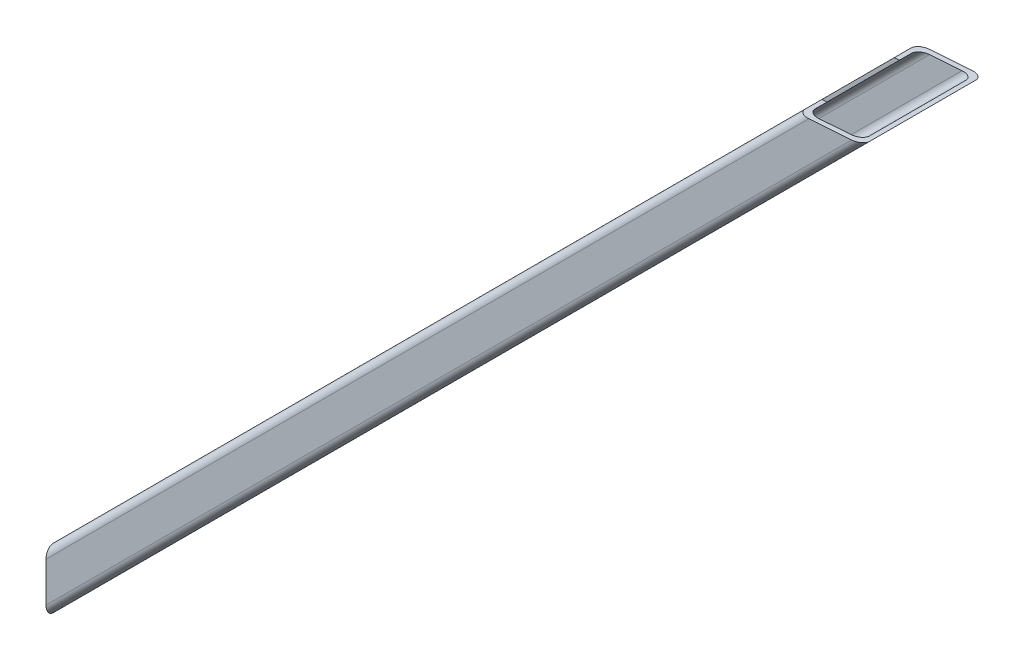
ISO-10303-21;
HEADER;
FILE_DESCRIPTION(('STEP AP214'),'2;1');
FILE_NAME('part.step','',(''),(''),'','','');
FILE_SCHEMA(('AUTOMOTIVE_DESIGN { 1 0 10303 214 1 1 1 1 }'));
ENDSEC;
DATA;
#1=APPLICATION_CONTEXT('core data for automotive mechanical design processes');
#2=APPLICATION_PROTOCOL_DEFINITION('international standard','automotive_design',2000,#1);
#3=PRODUCT_CONTEXT('',#1,'mechanical');
#4=PRODUCT('Part','Part','',(#3));
#5=PRODUCT_RELATED_PRODUCT_CATEGORY('part','',(#4));
#6=PRODUCT_DEFINITION_FORMATION('','',#4);
#7=PRODUCT_DEFINITION_CONTEXT('part definition',#1,'design');
#8=PRODUCT_DEFINITION('design','',#6,#7);
#9=PRODUCT_DEFINITION_SHAPE('','',#8);
#10=(LENGTH_UNIT() NAMED_UNIT(*) SI_UNIT(.MILLI.,.METRE.));
#11=(NAMED_UNIT(*) PLANE_ANGLE_UNIT() SI_UNIT($,.RADIAN.));
#12=(NAMED_UNIT(*) SI_UNIT($,.STERADIAN.) SOLID_ANGLE_UNIT());
#13=UNCERTAINTY_MEASURE_WITH_UNIT(LENGTH_MEASURE(1.E-05),#10,'distance_accuracy_value','');
#14=(GEOMETRIC_REPRESENTATION_CONTEXT(3) GLOBAL_UNCERTAINTY_ASSIGNED_CONTEXT((#13)) GLOBAL_UNIT_ASSIGNED_CONTEXT((#10,
#11,#12)) REPRESENTATION_CONTEXT('',''));
#15=CARTESIAN_POINT('',(0.,0.,0.));
#16=DIRECTION('',(0.,0.,1.));
#17=DIRECTION('',(1.,0.,0.));
#18=AXIS2_PLACEMENT_3D('',#15,#16,#17);
#19=CARTESIAN_POINT('',(750.740415748247,775.740415748239,-50.));
#20=DIRECTION('',(0.,0.,1.));
#21=DIRECTION('',(0.,-1.,0.));
#22=AXIS2_PLACEMENT_3D('',#19,#20,#21);
#23=PLANE('',#22);
#24=DIRECTION('',(0.,1.,0.));
#25=VECTOR('',#24,1.);
#26=CARTESIAN_POINT('',(0.,25.,-50.));
#27=LINE('',#26,#25);
#28=CARTESIAN_POINT('',(0.,-16.5147186257616,-50.));
#29=VERTEX_POINT('',#28);
#30=CARTESIAN_POINT('',(0.,16.5147186257615,-50.));
#31=VERTEX_POINT('',#30);
#32=EDGE_CURVE('E202',#29,#31,#27,.T.);
#33=ORIENTED_EDGE('',*,*,#32,.T.);
#34=DIRECTION('',(-0.707106781186551,-0.707106781186544,0.));
#35=VECTOR('',#34,1.);
#36=CARTESIAN_POINT('',(754.983056435366,771.49777506112,-50.));
#37=LINE('',#36,#35);
#38=CARTESIAN_POINT('',(633.182283742111,649.697002367866,-50.));
#39=VERTEX_POINT('',#38);
#40=EDGE_CURVE('E261',#31,#39,#37,.F.);
#41=ORIENTED_EDGE('',*,*,#40,.T.);
#42=DIRECTION('',(-0.997546761100416,-0.0700032814807309,0.));
#43=VECTOR('',#42,1.);
#44=CARTESIAN_POINT('',(758.966133401731,658.523939186085,-50.));
#45=LINE('',#44,#43);
#46=CARTESIAN_POINT('',(668.704508710731,652.189790084963,-50.));
#47=VERTEX_POINT('',#46);
#48=EDGE_CURVE('E184',#47,#39,#45,.T.);
#49=ORIENTED_EDGE('',*,*,#48,.F.);
#50=DIRECTION('',(-0.707106781186551,-0.707106781186544,0.));
#51=VECTOR('',#50,1.);
#52=CARTESIAN_POINT('',(771.497775061128,754.983056435358,-50.));
#53=LINE('',#52,#51);
#54=EDGE_CURVE('E258',#47,#29,#53,.T.);
#55=ORIENTED_EDGE('',*,*,#54,.T.);
#56=EDGE_LOOP('',(#33,#41,#49,#55));
#57=FACE_BOUND('',#56,.T.);
#58=ADVANCED_FACE('F34',(#57),#23,.F.);
#59=CARTESIAN_POINT('',(750.740415748247,775.740415748239,-30.));
#60=DIRECTION('',(0.707106781186544,-0.707106781186551,0.));
#61=DIRECTION('',(0.707106781186551,0.707106781186544,0.));
#62=AXIS2_PLACEMENT_3D('',#59,#60,#61);
#63=PLANE('',#62);
#64=DIRECTION('',(0.,0.,1.));
#65=VECTOR('',#64,1.);
#66=CARTESIAN_POINT('',(624.056603773591,649.056603773584,-30.0000000000001));
#67=LINE('',#66,#65);
#68=CARTESIAN_POINT('',(624.056603773591,649.056603773584,-44.));
#69=VERTEX_POINT('',#68);
#70=CARTESIAN_POINT('',(624.056603773591,649.056603773584,-30.));
#71=VERTEX_POINT('',#70);
#72=EDGE_CURVE('E171',#69,#71,#67,.T.);
#73=ORIENTED_EDGE('',*,*,#72,.F.);
#74=DIRECTION('',(-0.707106781186551,-0.707106781186544,0.));
#75=VECTOR('',#74,1.);
#76=CARTESIAN_POINT('',(750.740415748247,775.740415748239,-44.));
#77=LINE('',#76,#75);
#78=CARTESIAN_POINT('',(0.,25.,-44.));
#79=VERTEX_POINT('',#78);
#80=EDGE_CURVE('E256',#69,#79,#77,.T.);
#81=ORIENTED_EDGE('',*,*,#80,.T.);
#82=DIRECTION('',(0.,0.,1.));
#83=VECTOR('',#82,1.);
#84=CARTESIAN_POINT('',(0.,25.,-30.));
#85=LINE('',#84,#83);
#86=CARTESIAN_POINT('',(0.,25.,-30.));
#87=VERTEX_POINT('',#86);
#88=EDGE_CURVE('E198',#79,#87,#85,.T.);
#89=ORIENTED_EDGE('',*,*,#88,.T.);
#90=DIRECTION('',(-0.707106781186551,-0.707106781186544,0.));
#91=VECTOR('',#90,1.);
#92=CARTESIAN_POINT('',(750.740415748247,775.740415748239,-30.));
#93=LINE('',#92,#91);
#94=EDGE_CURVE('E191',#71,#87,#93,.T.);
#95=ORIENTED_EDGE('',*,*,#94,.F.);
#96=EDGE_LOOP('',(#73,#81,#89,#95));
#97=FACE_BOUND('',#96,.T.);
#98=ADVANCED_FACE('F196',(#97),#63,.F.);
#99=CARTESIAN_POINT('',(750.740415748247,775.740415748239,-30.));
#100=DIRECTION('',(0.,0.,-1.));
#101=DIRECTION('',(-1.,0.,0.));
#102=AXIS2_PLACEMENT_3D('',#99,#100,#101);
#103=PLANE('',#102);
#104=DIRECTION('',(0.997546761100416,0.0700032814807309,0.));
#105=VECTOR('',#104,1.);
#106=CARTESIAN_POINT('',(758.966133401731,658.523939186085,-30.));
#107=LINE('',#106,#105);
#108=CARTESIAN_POINT('',(628.358490566044,649.358490566037,-30.));
#109=VERTEX_POINT('',#108);
#110=EDGE_CURVE('E176',#71,#109,#107,.T.);
#111=ORIENTED_EDGE('',*,*,#110,.F.);
#112=ORIENTED_EDGE('',*,*,#94,.T.);
#113=DIRECTION('',(0.,-1.,0.));
#114=VECTOR('',#113,1.);
#115=CARTESIAN_POINT('',(0.,25.,-30.));
#116=LINE('',#115,#114);
#117=CARTESIAN_POINT('',(0.,21.,-30.));
#118=VERTEX_POINT('',#117);
#119=EDGE_CURVE('E199',#87,#118,#116,.T.);
#120=ORIENTED_EDGE('',*,*,#119,.T.);
#121=DIRECTION('',(-0.707106781186551,-0.707106781186544,0.));
#122=VECTOR('',#121,1.);
#123=CARTESIAN_POINT('',(750.740415748247,771.740415748239,-30.));
#124=LINE('',#123,#122);
#125=EDGE_CURVE('E193',#109,#118,#124,.T.);
#126=ORIENTED_EDGE('',*,*,#125,.F.);
#127=EDGE_LOOP('',(#111,#112,#120,#126));
#128=FACE_BOUND('',#127,.T.);
#129=ADVANCED_FACE('F189',(#128),#103,.F.);
#130=CARTESIAN_POINT('',(750.740415748247,771.740415748239,-30.));
#131=DIRECTION('',(-0.707106781186544,0.707106781186551,0.));
#132=DIRECTION('',(-0.707106781186551,-0.707106781186544,0.));
#133=AXIS2_PLACEMENT_3D('',#130,#131,#132);
#134=PLANE('',#133);
#135=DIRECTION('',(0.,0.,-1.));
#136=VECTOR('',#135,1.);
#137=CARTESIAN_POINT('',(0.,21.,-30.));
#138=LINE('',#137,#136);
#139=CARTESIAN_POINT('',(0.,21.,-40.));
#140=VERTEX_POINT('',#139);
#141=EDGE_CURVE('E209',#118,#140,#138,.T.);
#142=ORIENTED_EDGE('',*,*,#141,.T.);
#143=DIRECTION('',(-0.707106781186551,-0.707106781186544,0.));
#144=VECTOR('',#143,1.);
#145=CARTESIAN_POINT('',(628.358490566043,649.358490566037,-40.));
#146=LINE('',#145,#144);
#147=CARTESIAN_POINT('',(628.358490566044,649.358490566037,-40.));
#148=VERTEX_POINT('',#147);
#149=EDGE_CURVE('E224',#140,#148,#146,.F.);
#150=ORIENTED_EDGE('',*,*,#149,.T.);
#151=DIRECTION('',(0.,0.,-1.));
#152=VECTOR('',#151,1.);
#153=CARTESIAN_POINT('',(628.358490566044,649.358490566037,-30.0000000000001));
#154=LINE('',#153,#152);
#155=EDGE_CURVE('E194',#109,#148,#154,.T.);
#156=ORIENTED_EDGE('',*,*,#155,.F.);
#157=ORIENTED_EDGE('',*,*,#125,.T.);
#158=EDGE_LOOP('',(#142,#150,#156,#157));
#159=FACE_BOUND('',#158,.T.);
#160=ADVANCED_FACE('F384',(#159),#134,.F.);
#161=CARTESIAN_POINT('',(750.740415748247,771.740415748239,-46.));
#162=DIRECTION('',(0.,0.,-1.));
#163=DIRECTION('',(0.,1.,0.));
#164=AXIS2_PLACEMENT_3D('',#161,#162,#163);
#165=PLANE('',#164);
#166=DIRECTION('',(0.997546761100416,0.0700032814807309,0.));
#167=VECTOR('',#166,1.);
#168=CARTESIAN_POINT('',(758.686807214901,658.504337348413,-46.));
#169=LINE('',#168,#167);
#170=CARTESIAN_POINT('',(637.484170534564,649.998889160319,-46.));
#171=VERTEX_POINT('',#170);
#172=CARTESIAN_POINT('',(664.402621918278,651.88790329251,-46.));
#173=VERTEX_POINT('',#172);
#174=EDGE_CURVE('E310',#171,#173,#169,.T.);
#175=ORIENTED_EDGE('',*,*,#174,.F.);
#176=DIRECTION('',(-0.707106781186551,-0.707106781186544,0.));
#177=VECTOR('',#176,1.);
#178=CARTESIAN_POINT('',(4.24264068711877,16.7573593128802,-46.));
#179=LINE('',#178,#177);
#180=CARTESIAN_POINT('',(0.,12.5147186257615,-46.));
#181=VERTEX_POINT('',#180);
#182=EDGE_CURVE('E220',#171,#181,#179,.T.);
#183=ORIENTED_EDGE('',*,*,#182,.T.);
#184=DIRECTION('',(0.,-1.,0.));
#185=VECTOR('',#184,1.);
#186=CARTESIAN_POINT('',(0.,21.,-46.));
#187=LINE('',#186,#185);
#188=CARTESIAN_POINT('',(0.,-12.5147186257614,-46.));
#189=VERTEX_POINT('',#188);
#190=EDGE_CURVE('E294',#181,#189,#187,.T.);
#191=ORIENTED_EDGE('',*,*,#190,.T.);
#192=DIRECTION('',(-0.707106781186551,-0.707106781186544,0.));
#193=VECTOR('',#192,1.);
#194=CARTESIAN_POINT('',(669.285661199679,656.770942573911,-46.));
#195=LINE('',#194,#193);
#196=EDGE_CURVE('E218',#189,#173,#195,.F.);
#197=ORIENTED_EDGE('',*,*,#196,.T.);
#198=EDGE_LOOP('',(#175,#183,#191,#197));
#199=FACE_BOUND('',#198,.T.);
#200=ADVANCED_FACE('F391',(#199),#165,.F.);
#201=CARTESIAN_POINT('',(750.740415748247,729.740415748239,46.));
#202=DIRECTION('',(0.707106781186544,-0.707106781186551,0.));
#203=DIRECTION('',(0.707106781186551,0.707106781186544,0.));
#204=AXIS2_PLACEMENT_3D('',#201,#202,#203);
#205=PLANE('',#204);
#206=DIRECTION('',(0.,0.,1.));
#207=VECTOR('',#206,1.);
#208=CARTESIAN_POINT('',(673.528301886799,652.528301886792,46.));
#209=LINE('',#208,#207);
#210=CARTESIAN_POINT('',(673.528301886799,652.528301886792,-40.));
#211=VERTEX_POINT('',#210);
#212=CARTESIAN_POINT('',(673.528301886799,652.528301886792,40.));
#213=VERTEX_POINT('',#212);
#214=EDGE_CURVE('E302',#211,#213,#209,.T.);
#215=ORIENTED_EDGE('',*,*,#214,.F.);
#216=DIRECTION('',(-0.707106781186551,-0.707106781186544,0.));
#217=VECTOR('',#216,1.);
#218=CARTESIAN_POINT('',(-3.95403818382974E-13,-21.0000000000004,-40.));
#219=LINE('',#218,#217);
#220=CARTESIAN_POINT('',(0.,-21.,-40.));
#221=VERTEX_POINT('',#220);
#222=EDGE_CURVE('E269',#211,#221,#219,.T.);
#223=ORIENTED_EDGE('',*,*,#222,.T.);
#224=DIRECTION('',(0.,0.,1.));
#225=VECTOR('',#224,1.);
#226=CARTESIAN_POINT('',(0.,-21.,46.));
#227=LINE('',#226,#225);
#228=CARTESIAN_POINT('',(0.,-21.,40.));
#229=VERTEX_POINT('',#228);
#230=EDGE_CURVE('E287',#221,#229,#227,.T.);
#231=ORIENTED_EDGE('',*,*,#230,.T.);
#232=DIRECTION('',(-0.707106781186551,-0.707106781186544,0.));
#233=VECTOR('',#232,1.);
#234=CARTESIAN_POINT('',(673.528301886799,652.528301886792,40.));
#235=LINE('',#234,#233);
#236=EDGE_CURVE('E49',#229,#213,#235,.F.);
#237=ORIENTED_EDGE('',*,*,#236,.T.);
#238=EDGE_LOOP('',(#215,#223,#231,#237));
#239=FACE_BOUND('',#238,.T.);
#240=ADVANCED_FACE('F292',(#239),#205,.F.);
#241=CARTESIAN_POINT('',(750.740415748247,771.740415748239,46.));
#242=DIRECTION('',(0.,0.,1.));
#243=DIRECTION('',(0.,-1.,0.));
#244=AXIS2_PLACEMENT_3D('',#241,#242,#243);
#245=PLANE('',#244);
#246=DIRECTION('',(0.,1.,0.));
#247=VECTOR('',#246,1.);
#248=CARTESIAN_POINT('',(0.,21.,46.));
#249=LINE('',#248,#247);
#250=CARTESIAN_POINT('',(0.,-12.5147186257615,46.));
#251=VERTEX_POINT('',#250);
#252=CARTESIAN_POINT('',(0.,12.5147186257615,46.));
#253=VERTEX_POINT('',#252);
#254=EDGE_CURVE('E289',#251,#253,#249,.T.);
#255=ORIENTED_EDGE('',*,*,#254,.T.);
#256=DIRECTION('',(-0.707106781186551,-0.707106781186544,0.));
#257=VECTOR('',#256,1.);
#258=CARTESIAN_POINT('',(632.601131253163,645.115849878918,46.));
#259=LINE('',#258,#257);
#260=CARTESIAN_POINT('',(637.484170534564,649.998889160319,46.));
#261=VERTEX_POINT('',#260);
#262=EDGE_CURVE('E232',#253,#261,#259,.F.);
#263=ORIENTED_EDGE('',*,*,#262,.T.);
#264=DIRECTION('',(-0.997546761100416,-0.0700032814807309,0.));
#265=VECTOR('',#264,1.);
#266=CARTESIAN_POINT('',(758.686807214901,658.504337348413,46.));
#267=LINE('',#266,#265);
#268=CARTESIAN_POINT('',(664.402621918278,651.88790329251,46.));
#269=VERTEX_POINT('',#268);
#270=EDGE_CURVE('E300',#269,#261,#267,.T.);
#271=ORIENTED_EDGE('',*,*,#270,.F.);
#272=DIRECTION('',(-0.707106781186551,-0.707106781186544,0.));
#273=VECTOR('',#272,1.);
#274=CARTESIAN_POINT('',(-4.24264068711944,-16.7573593128809,46.));
#275=LINE('',#274,#273);
#276=EDGE_CURVE('E229',#269,#251,#275,.T.);
#277=ORIENTED_EDGE('',*,*,#276,.T.);
#278=EDGE_LOOP('',(#255,#263,#271,#277));
#279=FACE_BOUND('',#278,.T.);
#280=ADVANCED_FACE('F304',(#279),#245,.F.);
#281=CARTESIAN_POINT('',(750.740415748247,771.740415748239,46.));
#282=DIRECTION('',(-0.707106781186544,0.707106781186551,0.));
#283=DIRECTION('',(-0.707106781186551,-0.707106781186544,0.));
#284=AXIS2_PLACEMENT_3D('',#281,#282,#283);
#285=PLANE('',#284);
#286=DIRECTION('',(0.,0.,-1.));
#287=VECTOR('',#286,1.);
#288=CARTESIAN_POINT('',(628.358490566043,649.358490566037,45.9999999999999));
#289=LINE('',#288,#287);
#290=CARTESIAN_POINT('',(628.358490566043,649.358490566037,40.));
#291=VERTEX_POINT('',#290);
#292=CARTESIAN_POINT('',(628.358490566043,649.358490566037,30.));
#293=VERTEX_POINT('',#292);
#294=EDGE_CURVE('E306',#291,#293,#289,.T.);
#295=ORIENTED_EDGE('',*,*,#294,.F.);
#296=DIRECTION('',(-0.707106781186551,-0.707106781186544,0.));
#297=VECTOR('',#296,1.);
#298=CARTESIAN_POINT('',(0.,21.,40.));
#299=LINE('',#298,#297);
#300=CARTESIAN_POINT('',(0.,21.,40.));
#301=VERTEX_POINT('',#300);
#302=EDGE_CURVE('E226',#291,#301,#299,.T.);
#303=ORIENTED_EDGE('',*,*,#302,.T.);
#304=DIRECTION('',(0.,0.,-1.));
#305=VECTOR('',#304,1.);
#306=CARTESIAN_POINT('',(0.,21.,46.));
#307=LINE('',#306,#305);
#308=CARTESIAN_POINT('',(0.,21.,30.));
#309=VERTEX_POINT('',#308);
#310=EDGE_CURVE('E214',#301,#309,#307,.T.);
#311=ORIENTED_EDGE('',*,*,#310,.T.);
#312=DIRECTION('',(-0.707106781186551,-0.707106781186544,0.));
#313=VECTOR('',#312,1.);
#314=CARTESIAN_POINT('',(750.740415748247,771.740415748239,30.));
#315=LINE('',#314,#313);
#316=EDGE_CURVE('E210',#293,#309,#315,.T.);
#317=ORIENTED_EDGE('',*,*,#316,.F.);
#318=EDGE_LOOP('',(#295,#303,#311,#317));
#319=FACE_BOUND('',#318,.T.);
#320=ADVANCED_FACE('F354',(#319),#285,.F.);
#321=CARTESIAN_POINT('',(750.740415748247,775.740415748239,30.));
#322=DIRECTION('',(0.,0.,1.));
#323=DIRECTION('',(1.,0.,0.));
#324=AXIS2_PLACEMENT_3D('',#321,#322,#323);
#325=PLANE('',#324);
#326=DIRECTION('',(-0.997546761100416,-0.0700032814807309,0.));
#327=VECTOR('',#326,1.);
#328=CARTESIAN_POINT('',(758.966133401731,658.523939186085,30.));
#329=LINE('',#328,#327);
#330=CARTESIAN_POINT('',(624.05660377359,649.056603773584,30.));
#331=VERTEX_POINT('',#330);
#332=EDGE_CURVE('E308',#293,#331,#329,.T.);
#333=ORIENTED_EDGE('',*,*,#332,.F.);
#334=ORIENTED_EDGE('',*,*,#316,.T.);
#335=DIRECTION('',(0.,1.,0.));
#336=VECTOR('',#335,1.);
#337=CARTESIAN_POINT('',(0.,25.,30.));
#338=LINE('',#337,#336);
#339=CARTESIAN_POINT('',(0.,25.,30.));
#340=VERTEX_POINT('',#339);
#341=EDGE_CURVE('E213',#309,#340,#338,.T.);
#342=ORIENTED_EDGE('',*,*,#341,.T.);
#343=DIRECTION('',(-0.707106781186551,-0.707106781186544,0.));
#344=VECTOR('',#343,1.);
#345=CARTESIAN_POINT('',(750.740415748247,775.740415748239,30.));
#346=LINE('',#345,#344);
#347=EDGE_CURVE('E215',#331,#340,#346,.T.);
#348=ORIENTED_EDGE('',*,*,#347,.F.);
#349=EDGE_LOOP('',(#333,#334,#342,#348));
#350=FACE_BOUND('',#349,.T.);
#351=ADVANCED_FACE('F351',(#350),#325,.F.);
#352=CARTESIAN_POINT('',(750.740415748247,775.740415748239,50.));
#353=DIRECTION('',(0.707106781186544,-0.707106781186551,0.));
#354=DIRECTION('',(0.707106781186551,0.707106781186544,0.));
#355=AXIS2_PLACEMENT_3D('',#352,#353,#354);
#356=PLANE('',#355);
#357=DIRECTION('',(0.,0.,1.));
#358=VECTOR('',#357,1.);
#359=CARTESIAN_POINT('',(0.,25.,50.));
#360=LINE('',#359,#358);
#361=CARTESIAN_POINT('',(0.,25.,44.));
#362=VERTEX_POINT('',#361);
#363=EDGE_CURVE('E217',#340,#362,#360,.T.);
#364=ORIENTED_EDGE('',*,*,#363,.T.);
#365=DIRECTION('',(-0.707106781186551,-0.707106781186544,0.));
#366=VECTOR('',#365,1.);
#367=CARTESIAN_POINT('',(750.740415748247,775.740415748239,44.));
#368=LINE('',#367,#366);
#369=CARTESIAN_POINT('',(624.05660377359,649.056603773584,44.));
#370=VERTEX_POINT('',#369);
#371=EDGE_CURVE('E247',#362,#370,#368,.F.);
#372=ORIENTED_EDGE('',*,*,#371,.T.);
#373=DIRECTION('',(0.,0.,1.));
#374=VECTOR('',#373,1.);
#375=CARTESIAN_POINT('',(624.05660377359,649.056603773584,49.9999999999999));
#376=LINE('',#375,#374);
#377=EDGE_CURVE('E343',#331,#370,#376,.T.);
#378=ORIENTED_EDGE('',*,*,#377,.F.);
#379=ORIENTED_EDGE('',*,*,#347,.T.);
#380=EDGE_LOOP('',(#364,#372,#378,#379));
#381=FACE_BOUND('',#380,.T.);
#382=ADVANCED_FACE('F360',(#381),#356,.F.);
#383=CARTESIAN_POINT('',(750.740415748247,775.740415748239,50.));
#384=DIRECTION('',(0.,0.,-1.));
#385=DIRECTION('',(0.,1.,0.));
#386=AXIS2_PLACEMENT_3D('',#383,#384,#385);
#387=PLANE('',#386);
#388=DIRECTION('',(0.997546761100416,0.0700032814807309,0.));
#389=VECTOR('',#388,1.);
#390=CARTESIAN_POINT('',(758.966133401731,658.523939186085,50.));
#391=LINE('',#390,#389);
#392=CARTESIAN_POINT('',(633.182283742111,649.697002367866,50.));
#393=VERTEX_POINT('',#392);
#394=CARTESIAN_POINT('',(668.704508710731,652.189790084962,50.));
#395=VERTEX_POINT('',#394);
#396=EDGE_CURVE('E221',#393,#395,#391,.T.);
#397=ORIENTED_EDGE('',*,*,#396,.F.);
#398=DIRECTION('',(-0.707106781186551,-0.707106781186544,0.));
#399=VECTOR('',#398,1.);
#400=CARTESIAN_POINT('',(754.983056435366,771.49777506112,50.));
#401=LINE('',#400,#399);
#402=CARTESIAN_POINT('',(0.,16.5147186257615,50.));
#403=VERTEX_POINT('',#402);
#404=EDGE_CURVE('E236',#393,#403,#401,.T.);
#405=ORIENTED_EDGE('',*,*,#404,.T.);
#406=DIRECTION('',(0.,-1.,0.));
#407=VECTOR('',#406,1.);
#408=CARTESIAN_POINT('',(0.,25.,50.));
#409=LINE('',#408,#407);
#410=CARTESIAN_POINT('',(0.,-16.5147186257615,50.));
#411=VERTEX_POINT('',#410);
#412=EDGE_CURVE('E321',#403,#411,#409,.T.);
#413=ORIENTED_EDGE('',*,*,#412,.T.);
#414=DIRECTION('',(-0.707106781186551,-0.707106781186544,0.));
#415=VECTOR('',#414,1.);
#416=CARTESIAN_POINT('',(771.497775061128,754.983056435358,50.));
#417=LINE('',#416,#415);
#418=EDGE_CURVE('E234',#411,#395,#417,.F.);
#419=ORIENTED_EDGE('',*,*,#418,.T.);
#420=EDGE_LOOP('',(#397,#405,#413,#419));
#421=FACE_BOUND('',#420,.T.);
#422=ADVANCED_FACE('F367',(#421),#387,.F.);
#423=CARTESIAN_POINT('',(750.740415748247,725.740415748239,50.));
#424=DIRECTION('',(-0.707106781186544,0.707106781186551,0.));
#425=DIRECTION('',(-0.707106781186551,-0.707106781186544,0.));
#426=AXIS2_PLACEMENT_3D('',#423,#424,#425);
#427=PLANE('',#426);
#428=DIRECTION('',(0.,0.,-1.));
#429=VECTOR('',#428,1.);
#430=CARTESIAN_POINT('',(0.,-25.,50.));
#431=LINE('',#430,#429);
#432=CARTESIAN_POINT('',(0.,-25.,44.));
#433=VERTEX_POINT('',#432);
#434=CARTESIAN_POINT('',(0.,-25.,-44.));
#435=VERTEX_POINT('',#434);
#436=EDGE_CURVE('E317',#433,#435,#431,.T.);
#437=ORIENTED_EDGE('',*,*,#436,.T.);
#438=DIRECTION('',(-0.707106781186551,-0.707106781186544,0.));
#439=VECTOR('',#438,1.);
#440=CARTESIAN_POINT('',(750.740415748247,725.740415748239,-44.));
#441=LINE('',#440,#439);
#442=CARTESIAN_POINT('',(677.830188679252,652.830188679245,-44.));
#443=VERTEX_POINT('',#442);
#444=EDGE_CURVE('E266',#435,#443,#441,.F.);
#445=ORIENTED_EDGE('',*,*,#444,.T.);
#446=DIRECTION('',(0.,0.,-1.));
#447=VECTOR('',#446,1.);
#448=CARTESIAN_POINT('',(677.830188679252,652.830188679245,50.));
#449=LINE('',#448,#447);
#450=CARTESIAN_POINT('',(677.830188679252,652.830188679245,44.));
#451=VERTEX_POINT('',#450);
#452=EDGE_CURVE('E206',#451,#443,#449,.T.);
#453=ORIENTED_EDGE('',*,*,#452,.F.);
#454=DIRECTION('',(-0.707106781186551,-0.707106781186544,0.));
#455=VECTOR('',#454,1.);
#456=CARTESIAN_POINT('',(750.740415748247,725.740415748239,44.));
#457=LINE('',#456,#455);
#458=EDGE_CURVE('E263',#451,#433,#457,.T.);
#459=ORIENTED_EDGE('',*,*,#458,.T.);
#460=EDGE_LOOP('',(#437,#445,#453,#459));
#461=FACE_BOUND('',#460,.T.);
#462=ADVANCED_FACE('F371',(#461),#427,.F.);
#463=CARTESIAN_POINT('',(0.,0.,0.));
#464=DIRECTION('',(1.,0.,0.));
#465=DIRECTION('',(0.,0.,-1.));
#466=AXIS2_PLACEMENT_3D('',#463,#464,#465);
#467=PLANE('',#466);
#468=ORIENTED_EDGE('',*,*,#412,.F.);
#469=CARTESIAN_POINT('',(-1.11022302462516E-13,16.5147186257615,44.));
#470=DIRECTION('',(1.,0.,0.));
#471=DIRECTION('',(0.,-1.,0.));
#472=AXIS2_PLACEMENT_3D('',#469,#470,#471);
#473=ELLIPSE('',#472,8.48528137423853,6.);
#474=EDGE_CURVE('E245',#403,#362,#473,.F.);
#475=ORIENTED_EDGE('',*,*,#474,.T.);
#476=ORIENTED_EDGE('',*,*,#363,.F.);
#477=ORIENTED_EDGE('',*,*,#341,.F.);
#478=ORIENTED_EDGE('',*,*,#310,.F.);
#479=CARTESIAN_POINT('',(1.11022302462516E-13,12.5147186257616,40.));
#480=DIRECTION('',(1.,0.,0.));
#481=DIRECTION('',(0.,1.,0.));
#482=AXIS2_PLACEMENT_3D('',#479,#480,#481);
#483=ELLIPSE('',#482,8.48528137423853,6.);
#484=EDGE_CURVE('E276',#301,#253,#483,.T.);
#485=ORIENTED_EDGE('',*,*,#484,.T.);
#486=ORIENTED_EDGE('',*,*,#254,.F.);
#487=CARTESIAN_POINT('',(0.,-12.5147186257615,40.));
#488=DIRECTION('',(1.,0.,0.));
#489=DIRECTION('',(0.,1.,0.));
#490=AXIS2_PLACEMENT_3D('',#487,#488,#489);
#491=ELLIPSE('',#490,8.48528137423853,6.);
#492=EDGE_CURVE('E42',#251,#229,#491,.T.);
#493=ORIENTED_EDGE('',*,*,#492,.T.);
#494=ORIENTED_EDGE('',*,*,#230,.F.);
#495=CARTESIAN_POINT('',(0.,-12.5147186257616,-40.));
#496=DIRECTION('',(1.,0.,0.));
#497=DIRECTION('',(0.,1.,0.));
#498=AXIS2_PLACEMENT_3D('',#495,#496,#497);
#499=ELLIPSE('',#498,8.48528137423853,6.);
#500=EDGE_CURVE('E280',#221,#189,#499,.T.);
#501=ORIENTED_EDGE('',*,*,#500,.T.);
#502=ORIENTED_EDGE('',*,*,#190,.F.);
#503=CARTESIAN_POINT('',(-1.11022302462516E-13,12.5147186257615,-40.));
#504=DIRECTION('',(1.,0.,0.));
#505=DIRECTION('',(0.,1.,0.));
#506=AXIS2_PLACEMENT_3D('',#503,#504,#505);
#507=ELLIPSE('',#506,8.48528137423853,6.);
#508=EDGE_CURVE('E272',#181,#140,#507,.T.);
#509=ORIENTED_EDGE('',*,*,#508,.T.);
#510=ORIENTED_EDGE('',*,*,#141,.F.);
#511=ORIENTED_EDGE('',*,*,#119,.F.);
#512=ORIENTED_EDGE('',*,*,#88,.F.);
#513=CARTESIAN_POINT('',(-1.11022302462516E-13,16.5147186257615,-44.));
#514=DIRECTION('',(1.,0.,0.));
#515=DIRECTION('',(0.,-1.,0.));
#516=AXIS2_PLACEMENT_3D('',#513,#514,#515);
#517=ELLIPSE('',#516,8.48528137423853,6.);
#518=EDGE_CURVE('E243',#79,#31,#517,.F.);
#519=ORIENTED_EDGE('',*,*,#518,.T.);
#520=ORIENTED_EDGE('',*,*,#32,.F.);
#521=CARTESIAN_POINT('',(1.11022302462516E-13,-16.5147186257615,-44.));
#522=DIRECTION('',(1.,0.,0.));
#523=DIRECTION('',(0.,-1.,0.));
#524=AXIS2_PLACEMENT_3D('',#521,#522,#523);
#525=ELLIPSE('',#524,8.48528137423853,6.);
#526=EDGE_CURVE('E241',#29,#435,#525,.F.);
#527=ORIENTED_EDGE('',*,*,#526,.T.);
#528=ORIENTED_EDGE('',*,*,#436,.F.);
#529=CARTESIAN_POINT('',(0.,-16.5147186257616,44.));
#530=DIRECTION('',(1.,0.,0.));
#531=DIRECTION('',(0.,-1.,0.));
#532=AXIS2_PLACEMENT_3D('',#529,#530,#531);
#533=ELLIPSE('',#532,8.48528137423853,6.);
#534=EDGE_CURVE('E239',#433,#411,#533,.F.);
#535=ORIENTED_EDGE('',*,*,#534,.T.);
#536=EDGE_LOOP('',(#468,#475,#476,#477,#478,#485,#486,#493,#494,#501,#502,#509,#510,#511,#512,
#519,#520,#527,#528,#535));
#537=FACE_BOUND('',#536,.T.);
#538=ADVANCED_FACE('F286',(#537),#467,.F.);
#539=CARTESIAN_POINT('',(-217.640283301247,589.990155557806,49.9999999999985));
#540=DIRECTION('',(-0.0700032814807309,0.997546761100416,0.));
#541=DIRECTION('',(0.,0.,-1.));
#542=AXIS2_PLACEMENT_3D('',#539,#540,#541);
#543=PLANE('',#542);
#544=ORIENTED_EDGE('',*,*,#377,.T.);
#545=CARTESIAN_POINT('',(633.182283742111,649.697002367866,44.));
#546=DIRECTION('',(-0.0700032814807309,0.997546761100416,0.));
#547=DIRECTION('',(-0.997546761100416,-0.0700032814807309,0.));
#548=AXIS2_PLACEMENT_3D('',#545,#546,#547);
#549=ELLIPSE('',#548,9.14812249849224,6.);
#550=EDGE_CURVE('E254',#370,#393,#549,.T.);
#551=ORIENTED_EDGE('',*,*,#550,.T.);
#552=ORIENTED_EDGE('',*,*,#396,.T.);
#553=CARTESIAN_POINT('',(668.704508710731,652.189790084962,44.));
#554=DIRECTION('',(-0.0700032814807309,0.997546761100416,0.));
#555=DIRECTION('',(-0.997546761100416,-0.0700032814807309,0.));
#556=AXIS2_PLACEMENT_3D('',#553,#554,#555);
#557=ELLIPSE('',#556,9.14812249849224,6.);
#558=EDGE_CURVE('E249',#395,#451,#557,.T.);
#559=ORIENTED_EDGE('',*,*,#558,.T.);
#560=ORIENTED_EDGE('',*,*,#452,.T.);
#561=CARTESIAN_POINT('',(668.704508710731,652.189790084963,-44.));
#562=DIRECTION('',(-0.0700032814807309,0.997546761100416,0.));
#563=DIRECTION('',(-0.997546761100416,-0.0700032814807309,0.));
#564=AXIS2_PLACEMENT_3D('',#561,#562,#563);
#565=ELLIPSE('',#564,9.14812249849224,6.);
#566=EDGE_CURVE('E251',#443,#47,#565,.T.);
#567=ORIENTED_EDGE('',*,*,#566,.T.);
#568=ORIENTED_EDGE('',*,*,#48,.T.);
#569=CARTESIAN_POINT('',(633.182283742111,649.697002367866,-44.));
#570=DIRECTION('',(-0.0700032814807309,0.997546761100416,0.));
#571=DIRECTION('',(-0.997546761100416,-0.0700032814807309,0.));
#572=AXIS2_PLACEMENT_3D('',#569,#570,#571);
#573=ELLIPSE('',#572,9.14812249849224,6.);
#574=EDGE_CURVE('E179',#39,#69,#573,.T.);
#575=ORIENTED_EDGE('',*,*,#574,.T.);
#576=ORIENTED_EDGE('',*,*,#72,.T.);
#577=ORIENTED_EDGE('',*,*,#110,.T.);
#578=ORIENTED_EDGE('',*,*,#155,.T.);
#579=CARTESIAN_POINT('',(637.484170534564,649.998889160319,-40.));
#580=DIRECTION('',(-0.0700032814807309,0.997546761100416,0.));
#581=DIRECTION('',(0.997546761100416,0.0700032814807309,0.));
#582=AXIS2_PLACEMENT_3D('',#579,#580,#581);
#583=ELLIPSE('',#582,9.14812249849224,6.);
#584=EDGE_CURVE('E274',#148,#171,#583,.F.);
#585=ORIENTED_EDGE('',*,*,#584,.T.);
#586=ORIENTED_EDGE('',*,*,#174,.T.);
#587=CARTESIAN_POINT('',(664.402621918278,651.88790329251,-40.));
#588=DIRECTION('',(-0.0700032814807309,0.997546761100416,0.));
#589=DIRECTION('',(0.997546761100416,0.0700032814807309,0.));
#590=AXIS2_PLACEMENT_3D('',#587,#588,#589);
#591=ELLIPSE('',#590,9.14812249849224,6.);
#592=EDGE_CURVE('E56',#173,#211,#591,.F.);
#593=ORIENTED_EDGE('',*,*,#592,.T.);
#594=ORIENTED_EDGE('',*,*,#214,.T.);
#595=CARTESIAN_POINT('',(664.402621918278,651.88790329251,40.));
#596=DIRECTION('',(-0.0700032814807309,0.997546761100416,0.));
#597=DIRECTION('',(0.997546761100416,0.0700032814807309,0.));
#598=AXIS2_PLACEMENT_3D('',#595,#596,#597);
#599=ELLIPSE('',#598,9.14812249849224,6.);
#600=EDGE_CURVE('E11',#213,#269,#599,.F.);
#601=ORIENTED_EDGE('',*,*,#600,.T.);
#602=ORIENTED_EDGE('',*,*,#270,.T.);
#603=CARTESIAN_POINT('',(637.484170534564,649.998889160319,40.));
#604=DIRECTION('',(-0.0700032814807309,0.997546761100416,0.));
#605=DIRECTION('',(0.997546761100416,0.0700032814807309,0.));
#606=AXIS2_PLACEMENT_3D('',#603,#604,#605);
#607=ELLIPSE('',#606,9.14812249849224,6.);
#608=EDGE_CURVE('E278',#261,#291,#607,.F.);
#609=ORIENTED_EDGE('',*,*,#608,.T.);
#610=ORIENTED_EDGE('',*,*,#294,.T.);
#611=ORIENTED_EDGE('',*,*,#332,.T.);
#612=EDGE_LOOP('',(#544,#551,#552,#559,#560,#567,#568,#575,#576,#577,#578,#585,#586,#593,#594,
#601,#602,#609,#610,#611));
#613=FACE_BOUND('',#612,.T.);
#614=ADVANCED_FACE('F174',(#613),#543,.T.);
#615=CARTESIAN_POINT('',(754.983056435366,767.49777506112,-40.));
#616=DIRECTION('',(0.707106781186551,0.707106781186544,0.));
#617=DIRECTION('',(-0.707106781186544,0.707106781186551,0.));
#618=AXIS2_PLACEMENT_3D('',#615,#616,#617);
#619=CYLINDRICAL_SURFACE('',#618,6.);
#620=ORIENTED_EDGE('',*,*,#584,.F.);
#621=ORIENTED_EDGE('',*,*,#149,.F.);
#622=ORIENTED_EDGE('',*,*,#508,.F.);
#623=ORIENTED_EDGE('',*,*,#182,.F.);
#624=EDGE_LOOP('',(#620,#621,#622,#623));
#625=FACE_BOUND('',#624,.T.);
#626=ADVANCED_FACE('F387',(#625),#619,.F.);
#627=CARTESIAN_POINT('',(754.983056435366,767.49777506112,40.));
#628=DIRECTION('',(0.707106781186551,0.707106781186544,0.));
#629=DIRECTION('',(-0.707106781186544,0.707106781186551,0.));
#630=AXIS2_PLACEMENT_3D('',#627,#628,#629);
#631=CYLINDRICAL_SURFACE('',#630,6.);
#632=ORIENTED_EDGE('',*,*,#608,.F.);
#633=ORIENTED_EDGE('',*,*,#262,.F.);
#634=ORIENTED_EDGE('',*,*,#484,.F.);
#635=ORIENTED_EDGE('',*,*,#302,.F.);
#636=EDGE_LOOP('',(#632,#633,#634,#635));
#637=FACE_BOUND('',#636,.T.);
#638=ADVANCED_FACE('F414',(#637),#631,.F.);
#639=CARTESIAN_POINT('',(754.983056435366,771.49777506112,44.));
#640=DIRECTION('',(-0.707106781186551,-0.707106781186544,0.));
#641=DIRECTION('',(0.707106781186544,-0.707106781186551,0.));
#642=AXIS2_PLACEMENT_3D('',#639,#640,#641);
#643=CYLINDRICAL_SURFACE('',#642,6.);
#644=ORIENTED_EDGE('',*,*,#550,.F.);
#645=ORIENTED_EDGE('',*,*,#371,.F.);
#646=ORIENTED_EDGE('',*,*,#474,.F.);
#647=ORIENTED_EDGE('',*,*,#404,.F.);
#648=EDGE_LOOP('',(#644,#645,#646,#647));
#649=FACE_BOUND('',#648,.T.);
#650=ADVANCED_FACE('F362',(#649),#643,.T.);
#651=CARTESIAN_POINT('',(754.983056435366,771.49777506112,-44.));
#652=DIRECTION('',(-0.707106781186551,-0.707106781186544,0.));
#653=DIRECTION('',(0.707106781186544,-0.707106781186551,0.));
#654=AXIS2_PLACEMENT_3D('',#651,#652,#653);
#655=CYLINDRICAL_SURFACE('',#654,6.);
#656=ORIENTED_EDGE('',*,*,#574,.F.);
#657=ORIENTED_EDGE('',*,*,#40,.F.);
#658=ORIENTED_EDGE('',*,*,#518,.F.);
#659=ORIENTED_EDGE('',*,*,#80,.F.);
#660=EDGE_LOOP('',(#656,#657,#658,#659));
#661=FACE_BOUND('',#660,.T.);
#662=ADVANCED_FACE('F379',(#661),#655,.T.);
#663=CARTESIAN_POINT('',(771.497775061128,754.983056435358,-44.));
#664=DIRECTION('',(-0.707106781186551,-0.707106781186544,0.));
#665=DIRECTION('',(0.707106781186544,-0.707106781186551,0.));
#666=AXIS2_PLACEMENT_3D('',#663,#664,#665);
#667=CYLINDRICAL_SURFACE('',#666,6.);
#668=ORIENTED_EDGE('',*,*,#566,.F.);
#669=ORIENTED_EDGE('',*,*,#444,.F.);
#670=ORIENTED_EDGE('',*,*,#526,.F.);
#671=ORIENTED_EDGE('',*,*,#54,.F.);
#672=EDGE_LOOP('',(#668,#669,#670,#671));
#673=FACE_BOUND('',#672,.T.);
#674=ADVANCED_FACE('F373',(#673),#667,.T.);
#675=CARTESIAN_POINT('',(746.497775061128,733.983056435358,-40.));
#676=DIRECTION('',(0.707106781186551,0.707106781186544,0.));
#677=DIRECTION('',(-0.707106781186544,0.707106781186551,0.));
#678=AXIS2_PLACEMENT_3D('',#675,#676,#677);
#679=CYLINDRICAL_SURFACE('',#678,6.);
#680=ORIENTED_EDGE('',*,*,#592,.F.);
#681=ORIENTED_EDGE('',*,*,#196,.F.);
#682=ORIENTED_EDGE('',*,*,#500,.F.);
#683=ORIENTED_EDGE('',*,*,#222,.F.);
#684=EDGE_LOOP('',(#680,#681,#682,#683));
#685=FACE_BOUND('',#684,.T.);
#686=ADVANCED_FACE('F394',(#685),#679,.F.);
#687=CARTESIAN_POINT('',(767.497775061128,754.983056435358,40.));
#688=DIRECTION('',(0.707106781186551,0.707106781186544,0.));
#689=DIRECTION('',(-0.707106781186544,0.707106781186551,0.));
#690=AXIS2_PLACEMENT_3D('',#687,#688,#689);
#691=CYLINDRICAL_SURFACE('',#690,6.);
#692=ORIENTED_EDGE('',*,*,#600,.F.);
#693=ORIENTED_EDGE('',*,*,#236,.F.);
#694=ORIENTED_EDGE('',*,*,#492,.F.);
#695=ORIENTED_EDGE('',*,*,#276,.F.);
#696=EDGE_LOOP('',(#692,#693,#694,#695));
#697=FACE_BOUND('',#696,.T.);
#698=ADVANCED_FACE('F297',(#697),#691,.F.);
#699=CARTESIAN_POINT('',(746.497775061128,729.983056435358,44.));
#700=DIRECTION('',(-0.707106781186551,-0.707106781186544,0.));
#701=DIRECTION('',(0.707106781186544,-0.707106781186551,0.));
#702=AXIS2_PLACEMENT_3D('',#699,#700,#701);
#703=CYLINDRICAL_SURFACE('',#702,6.);
#704=ORIENTED_EDGE('',*,*,#558,.F.);
#705=ORIENTED_EDGE('',*,*,#418,.F.);
#706=ORIENTED_EDGE('',*,*,#534,.F.);
#707=ORIENTED_EDGE('',*,*,#458,.F.);
#708=EDGE_LOOP('',(#704,#705,#706,#707));
#709=FACE_BOUND('',#708,.T.);
#710=ADVANCED_FACE('F36',(#709),#703,.T.);
#711=CLOSED_SHELL('',(#58,#98,#129,#160,#200,#240,#280,#320,#351,#382,#422,#462,#538,#614,#626,
#638,#650,#662,#674,#686,#698,#710));
#712=MANIFOLD_SOLID_BREP('B2',#711);
#713=ADVANCED_BREP_SHAPE_REPRESENTATION('',(#18,#712),#14);
#714=SHAPE_DEFINITION_REPRESENTATION(#9,#713);
ENDSEC;
END-ISO-10303-21;
